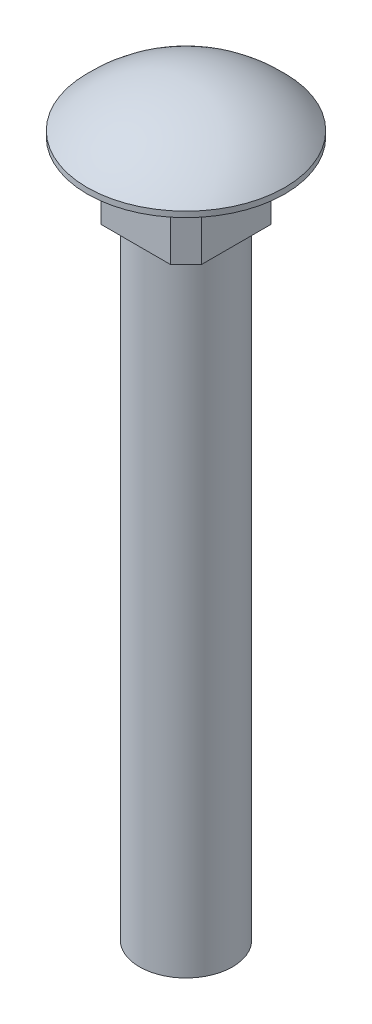
ISO-10303-21;
HEADER;
FILE_DESCRIPTION(('STEP AP214'),'2;1');
FILE_NAME('part.step','',(''),(''),'','','');
FILE_SCHEMA(('AUTOMOTIVE_DESIGN { 1 0 10303 214 1 1 1 1 }'));
ENDSEC;
DATA;
#1=APPLICATION_CONTEXT('core data for automotive mechanical design processes');
#2=APPLICATION_PROTOCOL_DEFINITION('international standard','automotive_design',2000,#1);
#3=PRODUCT_CONTEXT('',#1,'mechanical');
#4=PRODUCT('Part','Part','',(#3));
#5=PRODUCT_RELATED_PRODUCT_CATEGORY('part','',(#4));
#6=PRODUCT_DEFINITION_FORMATION('','',#4);
#7=PRODUCT_DEFINITION_CONTEXT('part definition',#1,'design');
#8=PRODUCT_DEFINITION('design','',#6,#7);
#9=PRODUCT_DEFINITION_SHAPE('','',#8);
#10=(LENGTH_UNIT() NAMED_UNIT(*) SI_UNIT(.MILLI.,.METRE.));
#11=(NAMED_UNIT(*) PLANE_ANGLE_UNIT() SI_UNIT($,.RADIAN.));
#12=(NAMED_UNIT(*) SI_UNIT($,.STERADIAN.) SOLID_ANGLE_UNIT());
#13=UNCERTAINTY_MEASURE_WITH_UNIT(LENGTH_MEASURE(1.E-05),#10,'distance_accuracy_value','');
#14=(GEOMETRIC_REPRESENTATION_CONTEXT(3) GLOBAL_UNCERTAINTY_ASSIGNED_CONTEXT((#13)) GLOBAL_UNIT_ASSIGNED_CONTEXT((#10,
#11,#12)) REPRESENTATION_CONTEXT('',''));
#15=CARTESIAN_POINT('',(0.,0.,0.));
#16=DIRECTION('',(0.,0.,1.));
#17=DIRECTION('',(1.,0.,0.));
#18=AXIS2_PLACEMENT_3D('',#15,#16,#17);
#19=CARTESIAN_POINT('',(-2.2,34.15,-2.2));
#20=DIRECTION('',(-0.707106781186548,0.,-0.707106781186548));
#21=DIRECTION('',(-0.707106781186548,0.,0.707106781186548));
#22=AXIS2_PLACEMENT_3D('',#19,#20,#21);
#23=PLANE('',#22);
#24=DIRECTION('',(0.707106781186548,0.,-0.707106781186548));
#25=VECTOR('',#24,1.);
#26=CARTESIAN_POINT('',(-2.6,32.4,-1.8));
#27=LINE('',#26,#25);
#28=CARTESIAN_POINT('',(-2.6,32.4,-1.8));
#29=VERTEX_POINT('',#28);
#30=CARTESIAN_POINT('',(-1.8,32.4,-2.6));
#31=VERTEX_POINT('',#30);
#32=EDGE_CURVE('E150',#29,#31,#27,.T.);
#33=ORIENTED_EDGE('',*,*,#32,.F.);
#34=DIRECTION('',(0.,-1.,0.));
#35=VECTOR('',#34,1.);
#36=CARTESIAN_POINT('',(-2.6,35.9,-1.8));
#37=LINE('',#36,#35);
#38=CARTESIAN_POINT('',(-2.6,35.9,-1.8));
#39=VERTEX_POINT('',#38);
#40=EDGE_CURVE('E172',#39,#29,#37,.T.);
#41=ORIENTED_EDGE('',*,*,#40,.F.);
#42=DIRECTION('',(-0.707106781186548,0.,0.707106781186548));
#43=VECTOR('',#42,1.);
#44=CARTESIAN_POINT('',(-1.8,35.9,-2.6));
#45=LINE('',#44,#43);
#46=CARTESIAN_POINT('',(-1.8,35.9,-2.6));
#47=VERTEX_POINT('',#46);
#48=EDGE_CURVE('E203',#47,#39,#45,.T.);
#49=ORIENTED_EDGE('',*,*,#48,.F.);
#50=DIRECTION('',(0.,-1.,0.));
#51=VECTOR('',#50,1.);
#52=CARTESIAN_POINT('',(-1.8,35.9,-2.6));
#53=LINE('',#52,#51);
#54=EDGE_CURVE('E11',#47,#31,#53,.T.);
#55=ORIENTED_EDGE('',*,*,#54,.T.);
#56=EDGE_LOOP('',(#33,#41,#49,#55));
#57=FACE_BOUND('',#56,.T.);
#58=ADVANCED_FACE('F17',(#57),#23,.T.);
#59=CARTESIAN_POINT('',(2.6,32.4,-2.6));
#60=DIRECTION('',(0.,0.,1.));
#61=DIRECTION('',(1.,0.,0.));
#62=AXIS2_PLACEMENT_3D('',#59,#60,#61);
#63=PLANE('',#62);
#64=ORIENTED_EDGE('',*,*,#54,.F.);
#65=DIRECTION('',(-1.,0.,0.));
#66=VECTOR('',#65,1.);
#67=CARTESIAN_POINT('',(1.8,35.9,-2.6));
#68=LINE('',#67,#66);
#69=CARTESIAN_POINT('',(1.8,35.9,-2.6));
#70=VERTEX_POINT('',#69);
#71=EDGE_CURVE('E231',#70,#47,#68,.T.);
#72=ORIENTED_EDGE('',*,*,#71,.F.);
#73=DIRECTION('',(0.,-1.,0.));
#74=VECTOR('',#73,1.);
#75=CARTESIAN_POINT('',(1.8,35.9,-2.6));
#76=LINE('',#75,#74);
#77=CARTESIAN_POINT('',(1.8,32.4,-2.6));
#78=VERTEX_POINT('',#77);
#79=EDGE_CURVE('E27',#70,#78,#76,.T.);
#80=ORIENTED_EDGE('',*,*,#79,.T.);
#81=DIRECTION('',(-1.,0.,0.));
#82=VECTOR('',#81,1.);
#83=CARTESIAN_POINT('',(1.8,32.4,-2.6));
#84=LINE('',#83,#82);
#85=EDGE_CURVE('E154',#78,#31,#84,.T.);
#86=ORIENTED_EDGE('',*,*,#85,.T.);
#87=EDGE_LOOP('',(#64,#72,#80,#86));
#88=FACE_BOUND('',#87,.T.);
#89=ADVANCED_FACE('F267',(#88),#63,.F.);
#90=CARTESIAN_POINT('',(2.2,34.15,-2.2));
#91=DIRECTION('',(0.707106781186548,0.,-0.707106781186548));
#92=DIRECTION('',(0.,-1.,0.));
#93=AXIS2_PLACEMENT_3D('',#90,#91,#92);
#94=PLANE('',#93);
#95=DIRECTION('',(0.707106781186548,0.,0.707106781186548));
#96=VECTOR('',#95,1.);
#97=CARTESIAN_POINT('',(1.8,32.4,-2.6));
#98=LINE('',#97,#96);
#99=CARTESIAN_POINT('',(2.6,32.4,-1.8));
#100=VERTEX_POINT('',#99);
#101=EDGE_CURVE('E158',#78,#100,#98,.T.);
#102=ORIENTED_EDGE('',*,*,#101,.F.);
#103=ORIENTED_EDGE('',*,*,#79,.F.);
#104=DIRECTION('',(-0.707106781186548,0.,-0.707106781186548));
#105=VECTOR('',#104,1.);
#106=CARTESIAN_POINT('',(2.6,35.9,-1.8));
#107=LINE('',#106,#105);
#108=CARTESIAN_POINT('',(2.6,35.9,-1.8));
#109=VERTEX_POINT('',#108);
#110=EDGE_CURVE('E224',#109,#70,#107,.T.);
#111=ORIENTED_EDGE('',*,*,#110,.F.);
#112=DIRECTION('',(0.,-1.,0.));
#113=VECTOR('',#112,1.);
#114=CARTESIAN_POINT('',(2.6,35.9,-1.8));
#115=LINE('',#114,#113);
#116=EDGE_CURVE('E169',#109,#100,#115,.T.);
#117=ORIENTED_EDGE('',*,*,#116,.T.);
#118=EDGE_LOOP('',(#102,#103,#111,#117));
#119=FACE_BOUND('',#118,.T.);
#120=ADVANCED_FACE('F252',(#119),#94,.T.);
#121=CARTESIAN_POINT('',(2.6,32.4,2.6));
#122=DIRECTION('',(-1.,0.,0.));
#123=DIRECTION('',(0.,0.,1.));
#124=AXIS2_PLACEMENT_3D('',#121,#122,#123);
#125=PLANE('',#124);
#126=ORIENTED_EDGE('',*,*,#116,.F.);
#127=DIRECTION('',(0.,0.,-1.));
#128=VECTOR('',#127,1.);
#129=CARTESIAN_POINT('',(2.6,35.9,1.8));
#130=LINE('',#129,#128);
#131=CARTESIAN_POINT('',(2.6,35.9,1.8));
#132=VERTEX_POINT('',#131);
#133=EDGE_CURVE('E210',#132,#109,#130,.T.);
#134=ORIENTED_EDGE('',*,*,#133,.F.);
#135=DIRECTION('',(0.,-1.,0.));
#136=VECTOR('',#135,1.);
#137=CARTESIAN_POINT('',(2.6,35.9,1.8));
#138=LINE('',#137,#136);
#139=CARTESIAN_POINT('',(2.6,32.4,1.8));
#140=VERTEX_POINT('',#139);
#141=EDGE_CURVE('E148',#132,#140,#138,.T.);
#142=ORIENTED_EDGE('',*,*,#141,.T.);
#143=DIRECTION('',(0.,0.,-1.));
#144=VECTOR('',#143,1.);
#145=CARTESIAN_POINT('',(2.6,32.4,1.8));
#146=LINE('',#145,#144);
#147=EDGE_CURVE('E159',#140,#100,#146,.T.);
#148=ORIENTED_EDGE('',*,*,#147,.T.);
#149=EDGE_LOOP('',(#126,#134,#142,#148));
#150=FACE_BOUND('',#149,.T.);
#151=ADVANCED_FACE('F364',(#150),#125,.F.);
#152=CARTESIAN_POINT('',(2.2,34.15,2.2));
#153=DIRECTION('',(0.707106781186548,0.,0.707106781186548));
#154=DIRECTION('',(0.,-1.,0.));
#155=AXIS2_PLACEMENT_3D('',#152,#153,#154);
#156=PLANE('',#155);
#157=DIRECTION('',(-0.707106781186548,0.,0.707106781186548));
#158=VECTOR('',#157,1.);
#159=CARTESIAN_POINT('',(2.6,32.4,1.8));
#160=LINE('',#159,#158);
#161=CARTESIAN_POINT('',(1.8,32.4,2.6));
#162=VERTEX_POINT('',#161);
#163=EDGE_CURVE('E163',#140,#162,#160,.T.);
#164=ORIENTED_EDGE('',*,*,#163,.F.);
#165=ORIENTED_EDGE('',*,*,#141,.F.);
#166=DIRECTION('',(0.707106781186548,0.,-0.707106781186548));
#167=VECTOR('',#166,1.);
#168=CARTESIAN_POINT('',(1.8,35.9,2.6));
#169=LINE('',#168,#167);
#170=CARTESIAN_POINT('',(1.8,35.9,2.6));
#171=VERTEX_POINT('',#170);
#172=EDGE_CURVE('E207',#171,#132,#169,.T.);
#173=ORIENTED_EDGE('',*,*,#172,.F.);
#174=DIRECTION('',(0.,-1.,0.));
#175=VECTOR('',#174,1.);
#176=CARTESIAN_POINT('',(1.8,35.9,2.6));
#177=LINE('',#176,#175);
#178=EDGE_CURVE('E212',#171,#162,#177,.T.);
#179=ORIENTED_EDGE('',*,*,#178,.T.);
#180=EDGE_LOOP('',(#164,#165,#173,#179));
#181=FACE_BOUND('',#180,.T.);
#182=ADVANCED_FACE('F369',(#181),#156,.T.);
#183=CARTESIAN_POINT('',(-2.6,32.4,2.6));
#184=DIRECTION('',(0.,0.,-1.));
#185=DIRECTION('',(0.,-1.,0.));
#186=AXIS2_PLACEMENT_3D('',#183,#184,#185);
#187=PLANE('',#186);
#188=DIRECTION('',(0.,-1.,0.));
#189=VECTOR('',#188,1.);
#190=CARTESIAN_POINT('',(-1.8,35.9,2.6));
#191=LINE('',#190,#189);
#192=CARTESIAN_POINT('',(-1.8,35.9,2.6));
#193=VERTEX_POINT('',#192);
#194=CARTESIAN_POINT('',(-1.8,32.4,2.6));
#195=VERTEX_POINT('',#194);
#196=EDGE_CURVE('E72',#193,#195,#191,.T.);
#197=ORIENTED_EDGE('',*,*,#196,.T.);
#198=DIRECTION('',(1.,0.,0.));
#199=VECTOR('',#198,1.);
#200=CARTESIAN_POINT('',(-1.8,32.4,2.6));
#201=LINE('',#200,#199);
#202=EDGE_CURVE('E168',#195,#162,#201,.T.);
#203=ORIENTED_EDGE('',*,*,#202,.T.);
#204=ORIENTED_EDGE('',*,*,#178,.F.);
#205=DIRECTION('',(1.,0.,0.));
#206=VECTOR('',#205,1.);
#207=CARTESIAN_POINT('',(-1.8,35.9,2.6));
#208=LINE('',#207,#206);
#209=EDGE_CURVE('E199',#193,#171,#208,.T.);
#210=ORIENTED_EDGE('',*,*,#209,.F.);
#211=EDGE_LOOP('',(#197,#203,#204,#210));
#212=FACE_BOUND('',#211,.T.);
#213=ADVANCED_FACE('F374',(#212),#187,.F.);
#214=CARTESIAN_POINT('',(0.,0.,0.));
#215=DIRECTION('',(0.,-1.,0.));
#216=DIRECTION('',(0.,0.,-1.));
#217=AXIS2_PLACEMENT_3D('',#214,#215,#216);
#218=PLANE('',#217);
#219=CARTESIAN_POINT('',(0.,0.,0.));
#220=DIRECTION('',(0.,1.,0.));
#221=DIRECTION('',(1.,0.,0.));
#222=AXIS2_PLACEMENT_3D('',#219,#220,#221);
#223=CIRCLE('',#222,2.4);
#224=CARTESIAN_POINT('',(2.4,0.,0.));
#225=VERTEX_POINT('',#224);
#226=EDGE_CURVE('E167',#225,#225,#223,.T.);
#227=ORIENTED_EDGE('',*,*,#226,.F.);
#228=EDGE_LOOP('',(#227));
#229=FACE_BOUND('',#228,.T.);
#230=ADVANCED_FACE('F19',(#229),#218,.T.);
#231=CARTESIAN_POINT('',(0.,40.32,0.));
#232=DIRECTION('',(0.,-1.,0.));
#233=DIRECTION('',(-1.,0.,0.));
#234=AXIS2_PLACEMENT_3D('',#231,#232,#233);
#235=CYLINDRICAL_SURFACE('',#234,2.4);
#236=ORIENTED_EDGE('',*,*,#226,.T.);
#237=DIRECTION('',(0.,1.,0.));
#238=VECTOR('',#237,1.);
#239=CARTESIAN_POINT('',(2.4,40.32,0.));
#240=LINE('',#239,#238);
#241=CARTESIAN_POINT('',(2.4,32.4,0.));
#242=VERTEX_POINT('',#241);
#243=EDGE_CURVE('E40',#225,#242,#240,.T.);
#244=ORIENTED_EDGE('',*,*,#243,.T.);
#245=CARTESIAN_POINT('',(0.,32.4,0.));
#246=DIRECTION('',(0.,-1.,0.));
#247=DIRECTION('',(1.,0.,0.));
#248=AXIS2_PLACEMENT_3D('',#245,#246,#247);
#249=CIRCLE('',#248,2.4);
#250=EDGE_CURVE('E164',#242,#242,#249,.T.);
#251=ORIENTED_EDGE('',*,*,#250,.T.);
#252=ORIENTED_EDGE('',*,*,#243,.F.);
#253=EDGE_LOOP('',(#236,#244,#251,#252));
#254=FACE_BOUND('',#253,.T.);
#255=ADVANCED_FACE('F391',(#254),#235,.T.);
#256=CARTESIAN_POINT('',(0.,32.4,0.));
#257=DIRECTION('',(0.,-1.,0.));
#258=DIRECTION('',(0.,0.,-1.));
#259=AXIS2_PLACEMENT_3D('',#256,#257,#258);
#260=PLANE('',#259);
#261=ORIENTED_EDGE('',*,*,#250,.F.);
#262=EDGE_LOOP('',(#261));
#263=FACE_BOUND('',#262,.T.);
#264=DIRECTION('',(-0.707106781186548,0.,-0.707106781186548));
#265=VECTOR('',#264,1.);
#266=CARTESIAN_POINT('',(-1.8,32.4,2.6));
#267=LINE('',#266,#265);
#268=CARTESIAN_POINT('',(-2.6,32.4,1.8));
#269=VERTEX_POINT('',#268);
#270=EDGE_CURVE('E193',#195,#269,#267,.T.);
#271=ORIENTED_EDGE('',*,*,#270,.T.);
#272=DIRECTION('',(0.,0.,1.));
#273=VECTOR('',#272,1.);
#274=CARTESIAN_POINT('',(-2.6,32.4,-1.8));
#275=LINE('',#274,#273);
#276=EDGE_CURVE('E176',#29,#269,#275,.T.);
#277=ORIENTED_EDGE('',*,*,#276,.F.);
#278=ORIENTED_EDGE('',*,*,#32,.T.);
#279=ORIENTED_EDGE('',*,*,#85,.F.);
#280=ORIENTED_EDGE('',*,*,#101,.T.);
#281=ORIENTED_EDGE('',*,*,#147,.F.);
#282=ORIENTED_EDGE('',*,*,#163,.T.);
#283=ORIENTED_EDGE('',*,*,#202,.F.);
#284=EDGE_LOOP('',(#271,#277,#278,#279,#280,#281,#282,#283));
#285=FACE_BOUND('',#284,.T.);
#286=ADVANCED_FACE('F268',(#263,#285),#260,.T.);
#287=CARTESIAN_POINT('',(-2.2,34.15,2.2));
#288=DIRECTION('',(-0.707106781186548,0.,0.707106781186548));
#289=DIRECTION('',(0.,1.,0.));
#290=AXIS2_PLACEMENT_3D('',#287,#288,#289);
#291=PLANE('',#290);
#292=ORIENTED_EDGE('',*,*,#270,.F.);
#293=ORIENTED_EDGE('',*,*,#196,.F.);
#294=DIRECTION('',(0.707106781186548,0.,0.707106781186548));
#295=VECTOR('',#294,1.);
#296=CARTESIAN_POINT('',(-2.6,35.9,1.8));
#297=LINE('',#296,#295);
#298=CARTESIAN_POINT('',(-2.6,35.9,1.8));
#299=VERTEX_POINT('',#298);
#300=EDGE_CURVE('E195',#299,#193,#297,.T.);
#301=ORIENTED_EDGE('',*,*,#300,.F.);
#302=DIRECTION('',(0.,-1.,0.));
#303=VECTOR('',#302,1.);
#304=CARTESIAN_POINT('',(-2.6,35.9,1.8));
#305=LINE('',#304,#303);
#306=EDGE_CURVE('E88',#299,#269,#305,.T.);
#307=ORIENTED_EDGE('',*,*,#306,.T.);
#308=EDGE_LOOP('',(#292,#293,#301,#307));
#309=FACE_BOUND('',#308,.T.);
#310=ADVANCED_FACE('F351',(#309),#291,.T.);
#311=CARTESIAN_POINT('',(-2.6,32.4,-2.6));
#312=DIRECTION('',(1.,0.,0.));
#313=DIRECTION('',(0.,1.,0.));
#314=AXIS2_PLACEMENT_3D('',#311,#312,#313);
#315=PLANE('',#314);
#316=ORIENTED_EDGE('',*,*,#306,.F.);
#317=DIRECTION('',(0.,0.,1.));
#318=VECTOR('',#317,1.);
#319=CARTESIAN_POINT('',(-2.6,35.9,-1.8));
#320=LINE('',#319,#318);
#321=EDGE_CURVE('E132',#39,#299,#320,.T.);
#322=ORIENTED_EDGE('',*,*,#321,.F.);
#323=ORIENTED_EDGE('',*,*,#40,.T.);
#324=ORIENTED_EDGE('',*,*,#276,.T.);
#325=EDGE_LOOP('',(#316,#322,#323,#324));
#326=FACE_BOUND('',#325,.T.);
#327=ADVANCED_FACE('F269',(#326),#315,.F.);
#328=CARTESIAN_POINT('',(0.,35.9,0.));
#329=DIRECTION('',(0.,-1.,0.));
#330=DIRECTION('',(0.,0.,-1.));
#331=AXIS2_PLACEMENT_3D('',#328,#329,#330);
#332=PLANE('',#331);
#333=ORIENTED_EDGE('',*,*,#321,.T.);
#334=ORIENTED_EDGE('',*,*,#300,.T.);
#335=ORIENTED_EDGE('',*,*,#209,.T.);
#336=ORIENTED_EDGE('',*,*,#172,.T.);
#337=ORIENTED_EDGE('',*,*,#133,.T.);
#338=ORIENTED_EDGE('',*,*,#110,.T.);
#339=ORIENTED_EDGE('',*,*,#71,.T.);
#340=ORIENTED_EDGE('',*,*,#48,.T.);
#341=EDGE_LOOP('',(#333,#334,#335,#336,#337,#338,#339,#340));
#342=FACE_BOUND('',#341,.T.);
#343=CARTESIAN_POINT('',(0.,35.9,0.));
#344=DIRECTION('',(0.,-1.,0.));
#345=DIRECTION('',(-1.,0.,0.));
#346=AXIS2_PLACEMENT_3D('',#343,#344,#345);
#347=CIRCLE('',#346,5.1);
#348=CARTESIAN_POINT('',(5.1,35.9,0.));
#349=VERTEX_POINT('',#348);
#350=EDGE_CURVE('E130',#349,#349,#347,.T.);
#351=ORIENTED_EDGE('',*,*,#350,.T.);
#352=EDGE_LOOP('',(#351));
#353=FACE_BOUND('',#352,.T.);
#354=ADVANCED_FACE('F246',(#342,#353),#332,.T.);
#355=CARTESIAN_POINT('',(0.,40.32,0.));
#356=DIRECTION('',(0.,-1.,0.));
#357=DIRECTION('',(-1.,0.,0.));
#358=AXIS2_PLACEMENT_3D('',#355,#356,#357);
#359=CYLINDRICAL_SURFACE('',#358,5.1);
#360=ORIENTED_EDGE('',*,*,#350,.F.);
#361=DIRECTION('',(0.,1.,0.));
#362=VECTOR('',#361,1.);
#363=CARTESIAN_POINT('',(5.1,40.32,0.));
#364=LINE('',#363,#362);
#365=CARTESIAN_POINT('',(5.1,36.19,0.));
#366=VERTEX_POINT('',#365);
#367=EDGE_CURVE('E124',#349,#366,#364,.T.);
#368=ORIENTED_EDGE('',*,*,#367,.T.);
#369=CARTESIAN_POINT('',(0.,36.19,0.));
#370=DIRECTION('',(0.,1.,0.));
#371=DIRECTION('',(1.,0.,0.));
#372=AXIS2_PLACEMENT_3D('',#369,#370,#371);
#373=CIRCLE('',#372,5.1);
#374=EDGE_CURVE('E128',#366,#366,#373,.T.);
#375=ORIENTED_EDGE('',*,*,#374,.F.);
#376=ORIENTED_EDGE('',*,*,#367,.F.);
#377=EDGE_LOOP('',(#360,#368,#375,#376));
#378=FACE_BOUND('',#377,.T.);
#379=ADVANCED_FACE('F126',(#378),#359,.T.);
#380=CARTESIAN_POINT('',(0.,31.41038461538,0.));
#381=DIRECTION('',(0.,-1.,0.));
#382=DIRECTION('',(-1.,0.,0.));
#383=AXIS2_PLACEMENT_3D('',#380,#381,#382);
#384=SPHERICAL_SURFACE('',#383,6.989615384615);
#385=ORIENTED_EDGE('',*,*,#374,.T.);
#386=CARTESIAN_POINT('',(0.,31.41038461538,0.));
#387=DIRECTION('',(0.,0.,1.));
#388=DIRECTION('',(1.,0.,0.));
#389=AXIS2_PLACEMENT_3D('',#386,#387,#388);
#390=CIRCLE('',#389,6.989615384615);
#391=CARTESIAN_POINT('',(0.,38.399999999995,0.));
#392=VERTEX_POINT('',#391);
#393=EDGE_CURVE('E135',#366,#392,#390,.T.);
#394=ORIENTED_EDGE('',*,*,#393,.T.);
#395=ORIENTED_EDGE('',*,*,#393,.F.);
#396=EDGE_LOOP('',(#385,#394,#395));
#397=FACE_BOUND('',#396,.T.);
#398=ADVANCED_FACE('F136',(#397),#384,.T.);
#399=CLOSED_SHELL('',(#58,#89,#120,#151,#182,#213,#230,#255,#286,#310,#327,#354,#379,#398));
#400=MANIFOLD_SOLID_BREP('B1',#399);
#401=ADVANCED_BREP_SHAPE_REPRESENTATION('',(#18,#400),#14);
#402=SHAPE_DEFINITION_REPRESENTATION(#9,#401);
ENDSEC;
END-ISO-10303-21;
